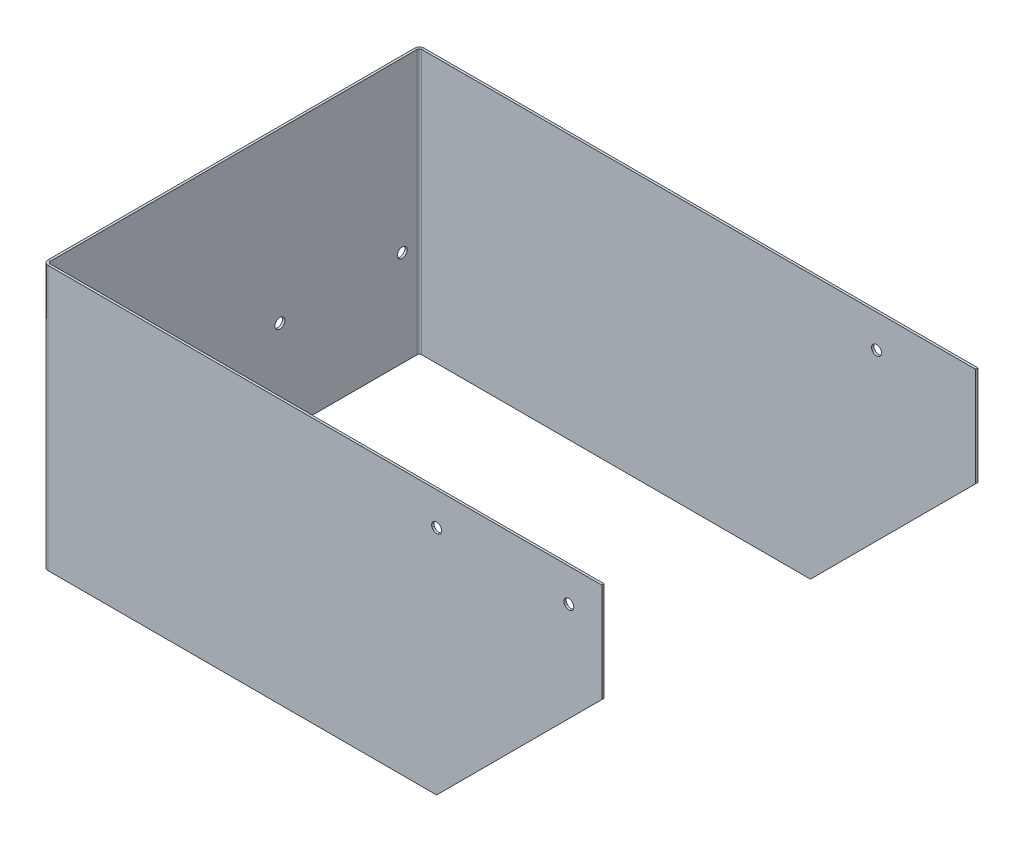
ISO-10303-21;
HEADER;
FILE_DESCRIPTION(('STEP AP214'),'2;1');
FILE_NAME('part.step','',(''),(''),'','','');
FILE_SCHEMA(('AUTOMOTIVE_DESIGN { 1 0 10303 214 1 1 1 1 }'));
ENDSEC;
DATA;
#1=APPLICATION_CONTEXT('core data for automotive mechanical design processes');
#2=APPLICATION_PROTOCOL_DEFINITION('international standard','automotive_design',2000,#1);
#3=PRODUCT_CONTEXT('',#1,'mechanical');
#4=PRODUCT('Part','Part','',(#3));
#5=PRODUCT_RELATED_PRODUCT_CATEGORY('part','',(#4));
#6=PRODUCT_DEFINITION_FORMATION('','',#4);
#7=PRODUCT_DEFINITION_CONTEXT('part definition',#1,'design');
#8=PRODUCT_DEFINITION('design','',#6,#7);
#9=PRODUCT_DEFINITION_SHAPE('','',#8);
#10=(LENGTH_UNIT() NAMED_UNIT(*) SI_UNIT(.MILLI.,.METRE.));
#11=(NAMED_UNIT(*) PLANE_ANGLE_UNIT() SI_UNIT($,.RADIAN.));
#12=(NAMED_UNIT(*) SI_UNIT($,.STERADIAN.) SOLID_ANGLE_UNIT());
#13=UNCERTAINTY_MEASURE_WITH_UNIT(LENGTH_MEASURE(1.E-05),#10,'distance_accuracy_value','');
#14=(GEOMETRIC_REPRESENTATION_CONTEXT(3) GLOBAL_UNCERTAINTY_ASSIGNED_CONTEXT((#13)) GLOBAL_UNIT_ASSIGNED_CONTEXT((#10,
#11,#12)) REPRESENTATION_CONTEXT('',''));
#15=CARTESIAN_POINT('',(0.,0.,0.));
#16=DIRECTION('',(0.,0.,1.));
#17=DIRECTION('',(1.,0.,0.));
#18=AXIS2_PLACEMENT_3D('',#15,#16,#17);
#19=CARTESIAN_POINT('',(1.40000000000001,80.,-56.9));
#20=DIRECTION('',(0.,1.,0.));
#21=DIRECTION('',(0.,0.,1.));
#22=AXIS2_PLACEMENT_3D('',#19,#20,#21);
#23=PLANE('',#22);
#24=DIRECTION('',(0.,0.,1.));
#25=VECTOR('',#24,1.);
#26=CARTESIAN_POINT('',(1.40000000000001,80.,-56.9));
#27=LINE('',#26,#25);
#28=CARTESIAN_POINT('',(1.40000000000001,80.,-56.9));
#29=VERTEX_POINT('',#28);
#30=CARTESIAN_POINT('',(1.40000000000001,80.,-56.2));
#31=VERTEX_POINT('',#30);
#32=EDGE_CURVE('E13',#29,#31,#27,.T.);
#33=ORIENTED_EDGE('',*,*,#32,.F.);
#34=CARTESIAN_POINT('',(1.40000000000001,80.,-55.5));
#35=DIRECTION('',(0.,-1.,0.));
#36=DIRECTION('',(0.,0.,-1.));
#37=AXIS2_PLACEMENT_3D('',#34,#35,#36);
#38=CIRCLE('',#37,1.4);
#39=CARTESIAN_POINT('',(0.,80.,-55.5));
#40=VERTEX_POINT('',#39);
#41=EDGE_CURVE('E245',#29,#40,#38,.F.);
#42=ORIENTED_EDGE('',*,*,#41,.T.);
#43=DIRECTION('',(-1.,0.,0.));
#44=VECTOR('',#43,1.);
#45=CARTESIAN_POINT('',(0.700000000000006,80.,-55.5));
#46=LINE('',#45,#44);
#47=CARTESIAN_POINT('',(0.700000000000006,80.,-55.5));
#48=VERTEX_POINT('',#47);
#49=EDGE_CURVE('E58',#48,#40,#46,.T.);
#50=ORIENTED_EDGE('',*,*,#49,.F.);
#51=CARTESIAN_POINT('',(1.40000000000001,80.,-55.5));
#52=DIRECTION('',(0.,1.,0.));
#53=DIRECTION('',(1.,0.,0.));
#54=AXIS2_PLACEMENT_3D('',#51,#52,#53);
#55=CIRCLE('',#54,0.7);
#56=EDGE_CURVE('E283',#31,#48,#55,.T.);
#57=ORIENTED_EDGE('',*,*,#56,.F.);
#58=EDGE_LOOP('',(#33,#42,#50,#57));
#59=FACE_BOUND('',#58,.T.);
#60=ADVANCED_FACE('F51',(#59),#23,.T.);
#61=CARTESIAN_POINT('',(0.700000000000006,80.,-55.5));
#62=DIRECTION('',(0.,1.,0.));
#63=DIRECTION('',(0.,0.,1.));
#64=AXIS2_PLACEMENT_3D('',#61,#62,#63);
#65=PLANE('',#64);
#66=DIRECTION('',(-1.,0.,0.));
#67=VECTOR('',#66,1.);
#68=CARTESIAN_POINT('',(169.,80.,-56.9));
#69=LINE('',#68,#67);
#70=CARTESIAN_POINT('',(169.,80.,-56.9));
#71=VERTEX_POINT('',#70);
#72=EDGE_CURVE('E249',#71,#29,#69,.T.);
#73=ORIENTED_EDGE('',*,*,#72,.T.);
#74=ORIENTED_EDGE('',*,*,#32,.T.);
#75=DIRECTION('',(-1.,0.,0.));
#76=VECTOR('',#75,1.);
#77=CARTESIAN_POINT('',(169.,80.,-56.2));
#78=LINE('',#77,#76);
#79=CARTESIAN_POINT('',(169.,80.,-56.2));
#80=VERTEX_POINT('',#79);
#81=EDGE_CURVE('E327',#80,#31,#78,.T.);
#82=ORIENTED_EDGE('',*,*,#81,.F.);
#83=DIRECTION('',(0.,0.,1.));
#84=VECTOR('',#83,1.);
#85=CARTESIAN_POINT('',(169.,80.,-56.9));
#86=LINE('',#85,#84);
#87=EDGE_CURVE('E330',#71,#80,#86,.T.);
#88=ORIENTED_EDGE('',*,*,#87,.F.);
#89=EDGE_LOOP('',(#73,#74,#82,#88));
#90=FACE_BOUND('',#89,.T.);
#91=ADVANCED_FACE('F334',(#90),#65,.T.);
#92=CARTESIAN_POINT('',(0.,0.,-55.5));
#93=DIRECTION('',(0.,-1.,0.));
#94=DIRECTION('',(0.,0.,-1.));
#95=AXIS2_PLACEMENT_3D('',#92,#93,#94);
#96=PLANE('',#95);
#97=DIRECTION('',(1.,0.,0.));
#98=VECTOR('',#97,1.);
#99=CARTESIAN_POINT('',(0.,0.,-55.5));
#100=LINE('',#99,#98);
#101=CARTESIAN_POINT('',(0.,0.,-55.5));
#102=VERTEX_POINT('',#101);
#103=CARTESIAN_POINT('',(0.700000000000006,0.,-55.5));
#104=VERTEX_POINT('',#103);
#105=EDGE_CURVE('E230',#102,#104,#100,.T.);
#106=ORIENTED_EDGE('',*,*,#105,.F.);
#107=CARTESIAN_POINT('',(1.40000000000001,0.,-55.5));
#108=DIRECTION('',(0.,-1.,0.));
#109=DIRECTION('',(0.,0.,-1.));
#110=AXIS2_PLACEMENT_3D('',#107,#108,#109);
#111=CIRCLE('',#110,1.4);
#112=CARTESIAN_POINT('',(1.40000000000001,0.,-56.9));
#113=VERTEX_POINT('',#112);
#114=EDGE_CURVE('E171',#113,#102,#111,.F.);
#115=ORIENTED_EDGE('',*,*,#114,.F.);
#116=DIRECTION('',(0.,0.,-1.));
#117=VECTOR('',#116,1.);
#118=CARTESIAN_POINT('',(1.40000000000001,0.,-56.2));
#119=LINE('',#118,#117);
#120=CARTESIAN_POINT('',(1.40000000000001,0.,-56.2));
#121=VERTEX_POINT('',#120);
#122=EDGE_CURVE('E169',#121,#113,#119,.T.);
#123=ORIENTED_EDGE('',*,*,#122,.F.);
#124=CARTESIAN_POINT('',(1.40000000000001,0.,-55.5));
#125=DIRECTION('',(0.,1.,0.));
#126=DIRECTION('',(1.,0.,0.));
#127=AXIS2_PLACEMENT_3D('',#124,#125,#126);
#128=CIRCLE('',#127,0.7);
#129=EDGE_CURVE('E177',#121,#104,#128,.T.);
#130=ORIENTED_EDGE('',*,*,#129,.T.);
#131=EDGE_LOOP('',(#106,#115,#123,#130));
#132=FACE_BOUND('',#131,.T.);
#133=ADVANCED_FACE('F276',(#132),#96,.T.);
#134=CARTESIAN_POINT('',(1.40000000000001,0.,-56.2));
#135=DIRECTION('',(0.,-1.,0.));
#136=DIRECTION('',(0.,0.,-1.));
#137=AXIS2_PLACEMENT_3D('',#134,#135,#136);
#138=PLANE('',#137);
#139=DIRECTION('',(0.,0.,1.));
#140=VECTOR('',#139,1.);
#141=CARTESIAN_POINT('',(0.,0.,0.));
#142=LINE('',#141,#140);
#143=CARTESIAN_POINT('',(0.,0.,55.5));
#144=VERTEX_POINT('',#143);
#145=EDGE_CURVE('E175',#102,#144,#142,.T.);
#146=ORIENTED_EDGE('',*,*,#145,.F.);
#147=ORIENTED_EDGE('',*,*,#105,.T.);
#148=DIRECTION('',(0.,0.,1.));
#149=VECTOR('',#148,1.);
#150=CARTESIAN_POINT('',(0.700000000000006,0.,-56.9));
#151=LINE('',#150,#149);
#152=CARTESIAN_POINT('',(0.700000000000006,0.,55.5));
#153=VERTEX_POINT('',#152);
#154=EDGE_CURVE('E271',#104,#153,#151,.T.);
#155=ORIENTED_EDGE('',*,*,#154,.T.);
#156=DIRECTION('',(-1.,0.,0.));
#157=VECTOR('',#156,1.);
#158=CARTESIAN_POINT('',(0.700000000000006,0.,55.5));
#159=LINE('',#158,#157);
#160=EDGE_CURVE('E221',#153,#144,#159,.T.);
#161=ORIENTED_EDGE('',*,*,#160,.T.);
#162=EDGE_LOOP('',(#146,#147,#155,#161));
#163=FACE_BOUND('',#162,.T.);
#164=ADVANCED_FACE('F289',(#163),#138,.T.);
#165=CARTESIAN_POINT('',(0.,80.,55.5));
#166=DIRECTION('',(0.,1.,0.));
#167=DIRECTION('',(0.,0.,1.));
#168=AXIS2_PLACEMENT_3D('',#165,#166,#167);
#169=PLANE('',#168);
#170=DIRECTION('',(1.,0.,0.));
#171=VECTOR('',#170,1.);
#172=CARTESIAN_POINT('',(0.,80.,55.5));
#173=LINE('',#172,#171);
#174=CARTESIAN_POINT('',(0.,80.,55.5));
#175=VERTEX_POINT('',#174);
#176=CARTESIAN_POINT('',(0.700000000000006,80.,55.5));
#177=VERTEX_POINT('',#176);
#178=EDGE_CURVE('E227',#175,#177,#173,.T.);
#179=ORIENTED_EDGE('',*,*,#178,.F.);
#180=CARTESIAN_POINT('',(1.39999999999998,80.,55.5));
#181=DIRECTION('',(0.,-1.,0.));
#182=DIRECTION('',(0.,0.,-1.));
#183=AXIS2_PLACEMENT_3D('',#180,#181,#182);
#184=CIRCLE('',#183,1.4);
#185=CARTESIAN_POINT('',(1.39999999999998,80.,56.9));
#186=VERTEX_POINT('',#185);
#187=EDGE_CURVE('E191',#175,#186,#184,.F.);
#188=ORIENTED_EDGE('',*,*,#187,.T.);
#189=DIRECTION('',(0.,0.,1.));
#190=VECTOR('',#189,1.);
#191=CARTESIAN_POINT('',(1.39999999999998,80.,56.2));
#192=LINE('',#191,#190);
#193=CARTESIAN_POINT('',(1.39999999999998,80.,56.2));
#194=VERTEX_POINT('',#193);
#195=EDGE_CURVE('E225',#194,#186,#192,.T.);
#196=ORIENTED_EDGE('',*,*,#195,.F.);
#197=CARTESIAN_POINT('',(1.39999999999998,80.,55.5));
#198=DIRECTION('',(0.,1.,0.));
#199=DIRECTION('',(1.,0.,0.));
#200=AXIS2_PLACEMENT_3D('',#197,#198,#199);
#201=CIRCLE('',#200,0.7);
#202=EDGE_CURVE('E305',#177,#194,#201,.T.);
#203=ORIENTED_EDGE('',*,*,#202,.F.);
#204=EDGE_LOOP('',(#179,#188,#196,#203));
#205=FACE_BOUND('',#204,.T.);
#206=ADVANCED_FACE('F424',(#205),#169,.T.);
#207=CARTESIAN_POINT('',(1.39999999999998,80.,56.2));
#208=DIRECTION('',(0.,1.,0.));
#209=DIRECTION('',(0.,0.,1.));
#210=AXIS2_PLACEMENT_3D('',#207,#208,#209);
#211=PLANE('',#210);
#212=DIRECTION('',(0.,0.,1.));
#213=VECTOR('',#212,1.);
#214=CARTESIAN_POINT('',(0.,80.,-56.9));
#215=LINE('',#214,#213);
#216=EDGE_CURVE('E237',#40,#175,#215,.T.);
#217=ORIENTED_EDGE('',*,*,#216,.T.);
#218=ORIENTED_EDGE('',*,*,#178,.T.);
#219=DIRECTION('',(0.,0.,1.));
#220=VECTOR('',#219,1.);
#221=CARTESIAN_POINT('',(0.700000000000006,80.,0.));
#222=LINE('',#221,#220);
#223=EDGE_CURVE('E240',#48,#177,#222,.T.);
#224=ORIENTED_EDGE('',*,*,#223,.F.);
#225=ORIENTED_EDGE('',*,*,#49,.T.);
#226=EDGE_LOOP('',(#217,#218,#224,#225));
#227=FACE_BOUND('',#226,.T.);
#228=ADVANCED_FACE('F235',(#227),#211,.T.);
#229=CARTESIAN_POINT('',(1.39999999999998,0.,56.9));
#230=DIRECTION('',(0.,-1.,0.));
#231=DIRECTION('',(0.,0.,-1.));
#232=AXIS2_PLACEMENT_3D('',#229,#230,#231);
#233=PLANE('',#232);
#234=DIRECTION('',(0.,0.,-1.));
#235=VECTOR('',#234,1.);
#236=CARTESIAN_POINT('',(1.39999999999998,0.,56.9));
#237=LINE('',#236,#235);
#238=CARTESIAN_POINT('',(1.39999999999998,0.,56.9));
#239=VERTEX_POINT('',#238);
#240=CARTESIAN_POINT('',(1.39999999999998,0.,56.2));
#241=VERTEX_POINT('',#240);
#242=EDGE_CURVE('E223',#239,#241,#237,.T.);
#243=ORIENTED_EDGE('',*,*,#242,.F.);
#244=CARTESIAN_POINT('',(1.39999999999998,0.,55.5));
#245=DIRECTION('',(0.,-1.,0.));
#246=DIRECTION('',(0.,0.,-1.));
#247=AXIS2_PLACEMENT_3D('',#244,#245,#246);
#248=CIRCLE('',#247,1.4);
#249=EDGE_CURVE('E183',#144,#239,#248,.F.);
#250=ORIENTED_EDGE('',*,*,#249,.F.);
#251=ORIENTED_EDGE('',*,*,#160,.F.);
#252=CARTESIAN_POINT('',(1.39999999999998,0.,55.5));
#253=DIRECTION('',(0.,1.,0.));
#254=DIRECTION('',(1.,0.,0.));
#255=AXIS2_PLACEMENT_3D('',#252,#253,#254);
#256=CIRCLE('',#255,0.7);
#257=EDGE_CURVE('E268',#153,#241,#256,.T.);
#258=ORIENTED_EDGE('',*,*,#257,.T.);
#259=EDGE_LOOP('',(#243,#250,#251,#258));
#260=FACE_BOUND('',#259,.T.);
#261=ADVANCED_FACE('F295',(#260),#233,.T.);
#262=CARTESIAN_POINT('',(0.700000000000006,0.,55.5));
#263=DIRECTION('',(0.,-1.,0.));
#264=DIRECTION('',(0.,0.,-1.));
#265=AXIS2_PLACEMENT_3D('',#262,#263,#264);
#266=PLANE('',#265);
#267=DIRECTION('',(0.,0.,1.));
#268=VECTOR('',#267,1.);
#269=CARTESIAN_POINT('',(119.,0.,-56.9));
#270=LINE('',#269,#268);
#271=CARTESIAN_POINT('',(119.,0.,56.2));
#272=VERTEX_POINT('',#271);
#273=CARTESIAN_POINT('',(119.,0.,56.9));
#274=VERTEX_POINT('',#273);
#275=EDGE_CURVE('E65',#272,#274,#270,.T.);
#276=ORIENTED_EDGE('',*,*,#275,.T.);
#277=DIRECTION('',(1.,0.,0.));
#278=VECTOR('',#277,1.);
#279=CARTESIAN_POINT('',(0.,0.,56.9));
#280=LINE('',#279,#278);
#281=EDGE_CURVE('E261',#239,#274,#280,.T.);
#282=ORIENTED_EDGE('',*,*,#281,.F.);
#283=ORIENTED_EDGE('',*,*,#242,.T.);
#284=DIRECTION('',(1.,0.,0.));
#285=VECTOR('',#284,1.);
#286=CARTESIAN_POINT('',(0.,0.,56.2));
#287=LINE('',#286,#285);
#288=EDGE_CURVE('E264',#241,#272,#287,.T.);
#289=ORIENTED_EDGE('',*,*,#288,.T.);
#290=EDGE_LOOP('',(#276,#282,#283,#289));
#291=FACE_BOUND('',#290,.T.);
#292=ADVANCED_FACE('F298',(#291),#266,.T.);
#293=CARTESIAN_POINT('',(0.,80.,56.9));
#294=DIRECTION('',(0.,0.,-1.));
#295=DIRECTION('',(-1.,0.,0.));
#296=AXIS2_PLACEMENT_3D('',#293,#294,#295);
#297=PLANE('',#296);
#298=CARTESIAN_POINT('',(159.,70.,56.9));
#299=DIRECTION('',(0.,0.,1.));
#300=DIRECTION('',(1.,0.,0.));
#301=AXIS2_PLACEMENT_3D('',#298,#299,#300);
#302=CIRCLE('',#301,1.5);
#303=CARTESIAN_POINT('',(160.5,70.,56.9));
#304=VERTEX_POINT('',#303);
#305=EDGE_CURVE('E343',#304,#304,#302,.T.);
#306=ORIENTED_EDGE('',*,*,#305,.F.);
#307=EDGE_LOOP('',(#306));
#308=FACE_BOUND('',#307,.T.);
#309=CARTESIAN_POINT('',(119.,70.,56.9));
#310=DIRECTION('',(0.,0.,1.));
#311=DIRECTION('',(1.,0.,0.));
#312=AXIS2_PLACEMENT_3D('',#309,#310,#311);
#313=CIRCLE('',#312,1.5);
#314=CARTESIAN_POINT('',(120.5,70.,56.9));
#315=VERTEX_POINT('',#314);
#316=EDGE_CURVE('E344',#315,#315,#313,.T.);
#317=ORIENTED_EDGE('',*,*,#316,.F.);
#318=EDGE_LOOP('',(#317));
#319=FACE_BOUND('',#318,.T.);
#320=ORIENTED_EDGE('',*,*,#281,.T.);
#321=DIRECTION('',(0.707106781186548,0.707106781186548,0.));
#322=VECTOR('',#321,1.);
#323=CARTESIAN_POINT('',(99.5,-19.5,56.9));
#324=LINE('',#323,#322);
#325=CARTESIAN_POINT('',(169.,50.,56.9));
#326=VERTEX_POINT('',#325);
#327=EDGE_CURVE('E265',#274,#326,#324,.T.);
#328=ORIENTED_EDGE('',*,*,#327,.T.);
#329=DIRECTION('',(0.,-1.,0.));
#330=VECTOR('',#329,1.);
#331=CARTESIAN_POINT('',(169.,80.,56.9));
#332=LINE('',#331,#330);
#333=CARTESIAN_POINT('',(169.,80.,56.9));
#334=VERTEX_POINT('',#333);
#335=EDGE_CURVE('E218',#334,#326,#332,.T.);
#336=ORIENTED_EDGE('',*,*,#335,.F.);
#337=DIRECTION('',(1.,0.,0.));
#338=VECTOR('',#337,1.);
#339=CARTESIAN_POINT('',(0.,80.,56.9));
#340=LINE('',#339,#338);
#341=EDGE_CURVE('E186',#186,#334,#340,.T.);
#342=ORIENTED_EDGE('',*,*,#341,.F.);
#343=DIRECTION('',(0.,-1.,0.));
#344=VECTOR('',#343,1.);
#345=CARTESIAN_POINT('',(1.39999999999998,80.,56.9));
#346=LINE('',#345,#344);
#347=EDGE_CURVE('E187',#186,#239,#346,.T.);
#348=ORIENTED_EDGE('',*,*,#347,.T.);
#349=EDGE_LOOP('',(#320,#328,#336,#342,#348));
#350=FACE_BOUND('',#349,.T.);
#351=ADVANCED_FACE('F434',(#308,#319,#350),#297,.F.);
#352=CARTESIAN_POINT('',(169.,80.,56.2));
#353=DIRECTION('',(1.,0.,0.));
#354=DIRECTION('',(0.,0.,-1.));
#355=AXIS2_PLACEMENT_3D('',#352,#353,#354);
#356=PLANE('',#355);
#357=DIRECTION('',(0.,0.,1.));
#358=VECTOR('',#357,1.);
#359=CARTESIAN_POINT('',(169.,50.,-56.9));
#360=LINE('',#359,#358);
#361=CARTESIAN_POINT('',(169.,50.,56.2));
#362=VERTEX_POINT('',#361);
#363=EDGE_CURVE('E155',#362,#326,#360,.T.);
#364=ORIENTED_EDGE('',*,*,#363,.F.);
#365=DIRECTION('',(0.,-1.,0.));
#366=VECTOR('',#365,1.);
#367=CARTESIAN_POINT('',(169.,80.,56.2));
#368=LINE('',#367,#366);
#369=CARTESIAN_POINT('',(169.,80.,56.2));
#370=VERTEX_POINT('',#369);
#371=EDGE_CURVE('E215',#370,#362,#368,.T.);
#372=ORIENTED_EDGE('',*,*,#371,.F.);
#373=DIRECTION('',(0.,0.,1.));
#374=VECTOR('',#373,1.);
#375=CARTESIAN_POINT('',(169.,80.,56.2));
#376=LINE('',#375,#374);
#377=EDGE_CURVE('E319',#370,#334,#376,.T.);
#378=ORIENTED_EDGE('',*,*,#377,.T.);
#379=ORIENTED_EDGE('',*,*,#335,.T.);
#380=EDGE_LOOP('',(#364,#372,#378,#379));
#381=FACE_BOUND('',#380,.T.);
#382=ADVANCED_FACE('F437',(#381),#356,.T.);
#383=CARTESIAN_POINT('',(0.,80.,56.2));
#384=DIRECTION('',(0.,0.,-1.));
#385=DIRECTION('',(-1.,0.,0.));
#386=AXIS2_PLACEMENT_3D('',#383,#384,#385);
#387=PLANE('',#386);
#388=CARTESIAN_POINT('',(159.,70.,56.2));
#389=DIRECTION('',(0.,0.,-1.));
#390=DIRECTION('',(-1.,0.,0.));
#391=AXIS2_PLACEMENT_3D('',#388,#389,#390);
#392=CIRCLE('',#391,1.5);
#393=CARTESIAN_POINT('',(157.5,70.,56.2));
#394=VERTEX_POINT('',#393);
#395=EDGE_CURVE('E165',#394,#394,#392,.F.);
#396=ORIENTED_EDGE('',*,*,#395,.T.);
#397=EDGE_LOOP('',(#396));
#398=FACE_BOUND('',#397,.T.);
#399=CARTESIAN_POINT('',(119.,70.,56.2));
#400=DIRECTION('',(0.,0.,-1.));
#401=DIRECTION('',(-1.,0.,0.));
#402=AXIS2_PLACEMENT_3D('',#399,#400,#401);
#403=CIRCLE('',#402,1.5);
#404=CARTESIAN_POINT('',(117.5,70.,56.2));
#405=VERTEX_POINT('',#404);
#406=EDGE_CURVE('E340',#405,#405,#403,.F.);
#407=ORIENTED_EDGE('',*,*,#406,.T.);
#408=EDGE_LOOP('',(#407));
#409=FACE_BOUND('',#408,.T.);
#410=DIRECTION('',(0.707106781186548,0.707106781186548,0.));
#411=VECTOR('',#410,1.);
#412=CARTESIAN_POINT('',(99.5,-19.5,56.2));
#413=LINE('',#412,#411);
#414=EDGE_CURVE('E310',#272,#362,#413,.T.);
#415=ORIENTED_EDGE('',*,*,#414,.F.);
#416=ORIENTED_EDGE('',*,*,#288,.F.);
#417=DIRECTION('',(0.,-1.,0.));
#418=VECTOR('',#417,1.);
#419=CARTESIAN_POINT('',(1.39999999999998,80.,56.2));
#420=LINE('',#419,#418);
#421=EDGE_CURVE('E212',#194,#241,#420,.T.);
#422=ORIENTED_EDGE('',*,*,#421,.F.);
#423=DIRECTION('',(1.,0.,0.));
#424=VECTOR('',#423,1.);
#425=CARTESIAN_POINT('',(0.,80.,56.2));
#426=LINE('',#425,#424);
#427=EDGE_CURVE('E322',#194,#370,#426,.T.);
#428=ORIENTED_EDGE('',*,*,#427,.T.);
#429=ORIENTED_EDGE('',*,*,#371,.T.);
#430=EDGE_LOOP('',(#415,#416,#422,#428,#429));
#431=FACE_BOUND('',#430,.T.);
#432=ADVANCED_FACE('F309',(#398,#409,#431),#387,.T.);
#433=CARTESIAN_POINT('',(1.39999999999998,80.,55.5));
#434=DIRECTION('',(0.,-1.,0.));
#435=DIRECTION('',(0.,0.,-1.));
#436=AXIS2_PLACEMENT_3D('',#433,#434,#435);
#437=CYLINDRICAL_SURFACE('',#436,0.7);
#438=ORIENTED_EDGE('',*,*,#257,.F.);
#439=DIRECTION('',(0.,-1.,0.));
#440=VECTOR('',#439,1.);
#441=CARTESIAN_POINT('',(0.700000000000006,80.,55.5));
#442=LINE('',#441,#440);
#443=EDGE_CURVE('E209',#177,#153,#442,.T.);
#444=ORIENTED_EDGE('',*,*,#443,.F.);
#445=ORIENTED_EDGE('',*,*,#202,.T.);
#446=ORIENTED_EDGE('',*,*,#421,.T.);
#447=EDGE_LOOP('',(#438,#444,#445,#446));
#448=FACE_BOUND('',#447,.T.);
#449=ADVANCED_FACE('F303',(#448),#437,.F.);
#450=CARTESIAN_POINT('',(0.700000000000006,80.,-56.9));
#451=DIRECTION('',(1.,0.,0.));
#452=DIRECTION('',(0.,0.,-1.));
#453=AXIS2_PLACEMENT_3D('',#450,#451,#452);
#454=PLANE('',#453);
#455=CARTESIAN_POINT('',(0.700000000000006,29.,-51.));
#456=DIRECTION('',(1.,0.,0.));
#457=DIRECTION('',(0.,0.,-1.));
#458=AXIS2_PLACEMENT_3D('',#455,#456,#457);
#459=CIRCLE('',#458,1.5);
#460=CARTESIAN_POINT('',(0.700000000000006,29.,-52.5));
#461=VERTEX_POINT('',#460);
#462=EDGE_CURVE('E357',#461,#461,#459,.F.);
#463=ORIENTED_EDGE('',*,*,#462,.T.);
#464=EDGE_LOOP('',(#463));
#465=FACE_BOUND('',#464,.T.);
#466=CARTESIAN_POINT('',(0.700000000000006,29.,-14.));
#467=DIRECTION('',(1.,0.,0.));
#468=DIRECTION('',(0.,0.,-1.));
#469=AXIS2_PLACEMENT_3D('',#466,#467,#468);
#470=CIRCLE('',#469,1.5);
#471=CARTESIAN_POINT('',(0.700000000000006,29.,-15.5));
#472=VERTEX_POINT('',#471);
#473=EDGE_CURVE('E371',#472,#472,#470,.F.);
#474=ORIENTED_EDGE('',*,*,#473,.T.);
#475=EDGE_LOOP('',(#474));
#476=FACE_BOUND('',#475,.T.);
#477=CARTESIAN_POINT('',(0.700000000000006,29.,14.));
#478=DIRECTION('',(1.,0.,0.));
#479=DIRECTION('',(0.,0.,-1.));
#480=AXIS2_PLACEMENT_3D('',#477,#478,#479);
#481=CIRCLE('',#480,1.5);
#482=CARTESIAN_POINT('',(0.700000000000006,29.,12.5));
#483=VERTEX_POINT('',#482);
#484=EDGE_CURVE('E365',#483,#483,#481,.F.);
#485=ORIENTED_EDGE('',*,*,#484,.T.);
#486=EDGE_LOOP('',(#485));
#487=FACE_BOUND('',#486,.T.);
#488=CARTESIAN_POINT('',(0.700000000000006,29.,51.));
#489=DIRECTION('',(1.,0.,0.));
#490=DIRECTION('',(0.,0.,-1.));
#491=AXIS2_PLACEMENT_3D('',#488,#489,#490);
#492=CIRCLE('',#491,1.5);
#493=CARTESIAN_POINT('',(0.700000000000006,29.,49.5));
#494=VERTEX_POINT('',#493);
#495=EDGE_CURVE('E358',#494,#494,#492,.F.);
#496=ORIENTED_EDGE('',*,*,#495,.T.);
#497=EDGE_LOOP('',(#496));
#498=FACE_BOUND('',#497,.T.);
#499=ORIENTED_EDGE('',*,*,#154,.F.);
#500=DIRECTION('',(0.,-1.,0.));
#501=VECTOR('',#500,1.);
#502=CARTESIAN_POINT('',(0.700000000000006,80.,-55.5));
#503=LINE('',#502,#501);
#504=EDGE_CURVE('E206',#48,#104,#503,.T.);
#505=ORIENTED_EDGE('',*,*,#504,.F.);
#506=ORIENTED_EDGE('',*,*,#223,.T.);
#507=ORIENTED_EDGE('',*,*,#443,.T.);
#508=EDGE_LOOP('',(#499,#505,#506,#507));
#509=FACE_BOUND('',#508,.T.);
#510=ADVANCED_FACE('F285',(#465,#476,#487,#498,#509),#454,.T.);
#511=CARTESIAN_POINT('',(1.40000000000001,80.,-55.5));
#512=DIRECTION('',(0.,-1.,0.));
#513=DIRECTION('',(0.,0.,-1.));
#514=AXIS2_PLACEMENT_3D('',#511,#512,#513);
#515=CYLINDRICAL_SURFACE('',#514,0.7);
#516=ORIENTED_EDGE('',*,*,#129,.F.);
#517=DIRECTION('',(0.,-1.,0.));
#518=VECTOR('',#517,1.);
#519=CARTESIAN_POINT('',(1.40000000000001,80.,-56.2));
#520=LINE('',#519,#518);
#521=EDGE_CURVE('E203',#31,#121,#520,.T.);
#522=ORIENTED_EDGE('',*,*,#521,.F.);
#523=ORIENTED_EDGE('',*,*,#56,.T.);
#524=ORIENTED_EDGE('',*,*,#504,.T.);
#525=EDGE_LOOP('',(#516,#522,#523,#524));
#526=FACE_BOUND('',#525,.T.);
#527=ADVANCED_FACE('F280',(#526),#515,.F.);
#528=CARTESIAN_POINT('',(169.,80.,-56.2));
#529=DIRECTION('',(0.,0.,1.));
#530=DIRECTION('',(1.,0.,0.));
#531=AXIS2_PLACEMENT_3D('',#528,#529,#530);
#532=PLANE('',#531);
#533=CARTESIAN_POINT('',(139.,70.,-56.2));
#534=DIRECTION('',(0.,0.,1.));
#535=DIRECTION('',(1.,0.,0.));
#536=AXIS2_PLACEMENT_3D('',#533,#534,#535);
#537=CIRCLE('',#536,1.5);
#538=CARTESIAN_POINT('',(140.5,70.,-56.2));
#539=VERTEX_POINT('',#538);
#540=EDGE_CURVE('E347',#539,#539,#537,.T.);
#541=ORIENTED_EDGE('',*,*,#540,.F.);
#542=EDGE_LOOP('',(#541));
#543=FACE_BOUND('',#542,.T.);
#544=DIRECTION('',(-0.707106781186548,-0.707106781186548,0.));
#545=VECTOR('',#544,1.);
#546=CARTESIAN_POINT('',(184.,65.,-56.2));
#547=LINE('',#546,#545);
#548=CARTESIAN_POINT('',(169.,50.,-56.2));
#549=VERTEX_POINT('',#548);
#550=CARTESIAN_POINT('',(119.,0.,-56.2));
#551=VERTEX_POINT('',#550);
#552=EDGE_CURVE('E73',#549,#551,#547,.T.);
#553=ORIENTED_EDGE('',*,*,#552,.F.);
#554=DIRECTION('',(0.,-1.,0.));
#555=VECTOR('',#554,1.);
#556=CARTESIAN_POINT('',(169.,80.,-56.2));
#557=LINE('',#556,#555);
#558=EDGE_CURVE('E200',#80,#549,#557,.T.);
#559=ORIENTED_EDGE('',*,*,#558,.F.);
#560=ORIENTED_EDGE('',*,*,#81,.T.);
#561=ORIENTED_EDGE('',*,*,#521,.T.);
#562=DIRECTION('',(-1.,0.,0.));
#563=VECTOR('',#562,1.);
#564=CARTESIAN_POINT('',(169.,0.,-56.2));
#565=LINE('',#564,#563);
#566=EDGE_CURVE('E172',#551,#121,#565,.T.);
#567=ORIENTED_EDGE('',*,*,#566,.F.);
#568=EDGE_LOOP('',(#553,#559,#560,#561,#567));
#569=FACE_BOUND('',#568,.T.);
#570=ADVANCED_FACE('F409',(#543,#569),#532,.T.);
#571=CARTESIAN_POINT('',(169.,80.,-56.9));
#572=DIRECTION('',(1.,0.,0.));
#573=DIRECTION('',(0.,0.,-1.));
#574=AXIS2_PLACEMENT_3D('',#571,#572,#573);
#575=PLANE('',#574);
#576=CARTESIAN_POINT('',(169.,50.,-56.9));
#577=VERTEX_POINT('',#576);
#578=EDGE_CURVE('E315',#577,#549,#360,.T.);
#579=ORIENTED_EDGE('',*,*,#578,.F.);
#580=DIRECTION('',(0.,-1.,0.));
#581=VECTOR('',#580,1.);
#582=CARTESIAN_POINT('',(169.,80.,-56.9));
#583=LINE('',#582,#581);
#584=EDGE_CURVE('E164',#71,#577,#583,.T.);
#585=ORIENTED_EDGE('',*,*,#584,.F.);
#586=ORIENTED_EDGE('',*,*,#87,.T.);
#587=ORIENTED_EDGE('',*,*,#558,.T.);
#588=EDGE_LOOP('',(#579,#585,#586,#587));
#589=FACE_BOUND('',#588,.T.);
#590=ADVANCED_FACE('F337',(#589),#575,.T.);
#591=CARTESIAN_POINT('',(169.,80.,-56.9));
#592=DIRECTION('',(0.,0.,1.));
#593=DIRECTION('',(1.,0.,0.));
#594=AXIS2_PLACEMENT_3D('',#591,#592,#593);
#595=PLANE('',#594);
#596=CARTESIAN_POINT('',(139.,70.,-56.9));
#597=DIRECTION('',(0.,0.,1.));
#598=DIRECTION('',(1.,0.,0.));
#599=AXIS2_PLACEMENT_3D('',#596,#597,#598);
#600=CIRCLE('',#599,1.5);
#601=CARTESIAN_POINT('',(140.5,70.,-56.9));
#602=VERTEX_POINT('',#601);
#603=EDGE_CURVE('E354',#602,#602,#600,.T.);
#604=ORIENTED_EDGE('',*,*,#603,.T.);
#605=EDGE_LOOP('',(#604));
#606=FACE_BOUND('',#605,.T.);
#607=ORIENTED_EDGE('',*,*,#584,.T.);
#608=DIRECTION('',(-0.707106781186547,-0.707106781186547,0.));
#609=VECTOR('',#608,1.);
#610=CARTESIAN_POINT('',(119.,0.,-56.9));
#611=LINE('',#610,#609);
#612=CARTESIAN_POINT('',(119.,0.,-56.9));
#613=VERTEX_POINT('',#612);
#614=EDGE_CURVE('E150',#577,#613,#611,.T.);
#615=ORIENTED_EDGE('',*,*,#614,.T.);
#616=DIRECTION('',(-1.,0.,0.));
#617=VECTOR('',#616,1.);
#618=CARTESIAN_POINT('',(169.,0.,-56.9));
#619=LINE('',#618,#617);
#620=EDGE_CURVE('E161',#613,#113,#619,.T.);
#621=ORIENTED_EDGE('',*,*,#620,.T.);
#622=DIRECTION('',(0.,-1.,0.));
#623=VECTOR('',#622,1.);
#624=CARTESIAN_POINT('',(1.40000000000001,80.,-56.9));
#625=LINE('',#624,#623);
#626=EDGE_CURVE('E197',#29,#113,#625,.T.);
#627=ORIENTED_EDGE('',*,*,#626,.F.);
#628=ORIENTED_EDGE('',*,*,#72,.F.);
#629=EDGE_LOOP('',(#607,#615,#621,#627,#628));
#630=FACE_BOUND('',#629,.T.);
#631=ADVANCED_FACE('F159',(#606,#630),#595,.F.);
#632=CARTESIAN_POINT('',(1.40000000000001,80.,-55.5));
#633=DIRECTION('',(0.,-1.,0.));
#634=DIRECTION('',(0.,0.,-1.));
#635=AXIS2_PLACEMENT_3D('',#632,#633,#634);
#636=CYLINDRICAL_SURFACE('',#635,1.4);
#637=ORIENTED_EDGE('',*,*,#114,.T.);
#638=DIRECTION('',(0.,-1.,0.));
#639=VECTOR('',#638,1.);
#640=CARTESIAN_POINT('',(0.,80.,-55.5));
#641=LINE('',#640,#639);
#642=EDGE_CURVE('E194',#40,#102,#641,.T.);
#643=ORIENTED_EDGE('',*,*,#642,.F.);
#644=ORIENTED_EDGE('',*,*,#41,.F.);
#645=ORIENTED_EDGE('',*,*,#626,.T.);
#646=EDGE_LOOP('',(#637,#643,#644,#645));
#647=FACE_BOUND('',#646,.T.);
#648=ADVANCED_FACE('F251',(#647),#636,.T.);
#649=CARTESIAN_POINT('',(0.,80.,0.));
#650=DIRECTION('',(1.,0.,0.));
#651=DIRECTION('',(0.,0.,-1.));
#652=AXIS2_PLACEMENT_3D('',#649,#650,#651);
#653=PLANE('',#652);
#654=CARTESIAN_POINT('',(0.,29.,-51.));
#655=DIRECTION('',(-1.,0.,0.));
#656=DIRECTION('',(0.,0.,1.));
#657=AXIS2_PLACEMENT_3D('',#654,#655,#656);
#658=CIRCLE('',#657,1.5);
#659=CARTESIAN_POINT('',(0.,29.,-49.5));
#660=VERTEX_POINT('',#659);
#661=EDGE_CURVE('E374',#660,#660,#658,.T.);
#662=ORIENTED_EDGE('',*,*,#661,.F.);
#663=EDGE_LOOP('',(#662));
#664=FACE_BOUND('',#663,.T.);
#665=CARTESIAN_POINT('',(0.,29.,-14.));
#666=DIRECTION('',(-1.,0.,0.));
#667=DIRECTION('',(0.,0.,1.));
#668=AXIS2_PLACEMENT_3D('',#665,#666,#667);
#669=CIRCLE('',#668,1.5);
#670=CARTESIAN_POINT('',(0.,29.,-12.5));
#671=VERTEX_POINT('',#670);
#672=EDGE_CURVE('E368',#671,#671,#669,.T.);
#673=ORIENTED_EDGE('',*,*,#672,.F.);
#674=EDGE_LOOP('',(#673));
#675=FACE_BOUND('',#674,.T.);
#676=CARTESIAN_POINT('',(0.,29.,14.));
#677=DIRECTION('',(-1.,0.,0.));
#678=DIRECTION('',(0.,0.,-1.));
#679=AXIS2_PLACEMENT_3D('',#676,#677,#678);
#680=CIRCLE('',#679,1.5);
#681=CARTESIAN_POINT('',(0.,29.,12.5));
#682=VERTEX_POINT('',#681);
#683=EDGE_CURVE('E361',#682,#682,#680,.T.);
#684=ORIENTED_EDGE('',*,*,#683,.F.);
#685=EDGE_LOOP('',(#684));
#686=FACE_BOUND('',#685,.T.);
#687=CARTESIAN_POINT('',(0.,29.,51.));
#688=DIRECTION('',(-1.,0.,0.));
#689=DIRECTION('',(0.,0.,-1.));
#690=AXIS2_PLACEMENT_3D('',#687,#688,#689);
#691=CIRCLE('',#690,1.5);
#692=CARTESIAN_POINT('',(0.,29.,49.5));
#693=VERTEX_POINT('',#692);
#694=EDGE_CURVE('E362',#693,#693,#691,.T.);
#695=ORIENTED_EDGE('',*,*,#694,.F.);
#696=EDGE_LOOP('',(#695));
#697=FACE_BOUND('',#696,.T.);
#698=ORIENTED_EDGE('',*,*,#145,.T.);
#699=DIRECTION('',(0.,-1.,0.));
#700=VECTOR('',#699,1.);
#701=CARTESIAN_POINT('',(0.,80.,55.5));
#702=LINE('',#701,#700);
#703=EDGE_CURVE('E190',#175,#144,#702,.T.);
#704=ORIENTED_EDGE('',*,*,#703,.F.);
#705=ORIENTED_EDGE('',*,*,#216,.F.);
#706=ORIENTED_EDGE('',*,*,#642,.T.);
#707=EDGE_LOOP('',(#698,#704,#705,#706));
#708=FACE_BOUND('',#707,.T.);
#709=ADVANCED_FACE('F254',(#664,#675,#686,#697,#708),#653,.F.);
#710=CARTESIAN_POINT('',(1.39999999999998,80.,55.5));
#711=DIRECTION('',(0.,-1.,0.));
#712=DIRECTION('',(0.,0.,-1.));
#713=AXIS2_PLACEMENT_3D('',#710,#711,#712);
#714=CYLINDRICAL_SURFACE('',#713,1.4);
#715=ORIENTED_EDGE('',*,*,#249,.T.);
#716=ORIENTED_EDGE('',*,*,#347,.F.);
#717=ORIENTED_EDGE('',*,*,#187,.F.);
#718=ORIENTED_EDGE('',*,*,#703,.T.);
#719=EDGE_LOOP('',(#715,#716,#717,#718));
#720=FACE_BOUND('',#719,.T.);
#721=ADVANCED_FACE('F292',(#720),#714,.T.);
#722=CARTESIAN_POINT('',(1.39999999999998,80.,55.5));
#723=DIRECTION('',(0.,1.,0.));
#724=DIRECTION('',(1.,0.,0.));
#725=AXIS2_PLACEMENT_3D('',#722,#723,#724);
#726=PLANE('',#725);
#727=ORIENTED_EDGE('',*,*,#341,.T.);
#728=ORIENTED_EDGE('',*,*,#377,.F.);
#729=ORIENTED_EDGE('',*,*,#427,.F.);
#730=ORIENTED_EDGE('',*,*,#195,.T.);
#731=EDGE_LOOP('',(#727,#728,#729,#730));
#732=FACE_BOUND('',#731,.T.);
#733=ADVANCED_FACE('F466',(#732),#726,.T.);
#734=CARTESIAN_POINT('',(1.39999999999998,0.,55.5));
#735=DIRECTION('',(0.,1.,0.));
#736=DIRECTION('',(1.,0.,0.));
#737=AXIS2_PLACEMENT_3D('',#734,#735,#736);
#738=PLANE('',#737);
#739=ORIENTED_EDGE('',*,*,#620,.F.);
#740=EDGE_CURVE('E147',#613,#551,#270,.T.);
#741=ORIENTED_EDGE('',*,*,#740,.T.);
#742=ORIENTED_EDGE('',*,*,#566,.T.);
#743=ORIENTED_EDGE('',*,*,#122,.T.);
#744=EDGE_LOOP('',(#739,#741,#742,#743));
#745=FACE_BOUND('',#744,.T.);
#746=ADVANCED_FACE('F167',(#745),#738,.F.);
#747=CARTESIAN_POINT('',(119.,0.,-56.9));
#748=DIRECTION('',(-0.707106781186547,0.707106781186547,0.));
#749=DIRECTION('',(-0.707106781186548,-0.707106781186548,0.));
#750=AXIS2_PLACEMENT_3D('',#747,#748,#749);
#751=PLANE('',#750);
#752=ORIENTED_EDGE('',*,*,#552,.T.);
#753=ORIENTED_EDGE('',*,*,#740,.F.);
#754=ORIENTED_EDGE('',*,*,#614,.F.);
#755=ORIENTED_EDGE('',*,*,#578,.T.);
#756=EDGE_LOOP('',(#752,#753,#754,#755));
#757=FACE_BOUND('',#756,.T.);
#758=ADVANCED_FACE('F149',(#757),#751,.F.);
#759=ORIENTED_EDGE('',*,*,#275,.F.);
#760=ORIENTED_EDGE('',*,*,#414,.T.);
#761=ORIENTED_EDGE('',*,*,#363,.T.);
#762=ORIENTED_EDGE('',*,*,#327,.F.);
#763=EDGE_LOOP('',(#759,#760,#761,#762));
#764=FACE_BOUND('',#763,.T.);
#765=ADVANCED_FACE('F453',(#764),#751,.F.);
#766=CARTESIAN_POINT('',(119.,70.,51.9573593128807));
#767=DIRECTION('',(0.,0.,1.));
#768=DIRECTION('',(1.,0.,0.));
#769=AXIS2_PLACEMENT_3D('',#766,#767,#768);
#770=CYLINDRICAL_SURFACE('',#769,1.5);
#771=ORIENTED_EDGE('',*,*,#316,.T.);
#772=EDGE_LOOP('',(#771));
#773=FACE_BOUND('',#772,.T.);
#774=ORIENTED_EDGE('',*,*,#406,.F.);
#775=EDGE_LOOP('',(#774));
#776=FACE_BOUND('',#775,.T.);
#777=ADVANCED_FACE('F450',(#773,#776),#770,.F.);
#778=CARTESIAN_POINT('',(159.,70.,51.9573593128807));
#779=DIRECTION('',(0.,0.,1.));
#780=DIRECTION('',(1.,0.,0.));
#781=AXIS2_PLACEMENT_3D('',#778,#779,#780);
#782=CYLINDRICAL_SURFACE('',#781,1.5);
#783=ORIENTED_EDGE('',*,*,#305,.T.);
#784=EDGE_LOOP('',(#783));
#785=FACE_BOUND('',#784,.T.);
#786=ORIENTED_EDGE('',*,*,#395,.F.);
#787=EDGE_LOOP('',(#786));
#788=FACE_BOUND('',#787,.T.);
#789=ADVANCED_FACE('F452',(#785,#788),#782,.F.);
#790=CARTESIAN_POINT('',(139.,70.,-51.9573593128807));
#791=DIRECTION('',(0.,0.,-1.));
#792=DIRECTION('',(-1.,0.,0.));
#793=AXIS2_PLACEMENT_3D('',#790,#791,#792);
#794=CYLINDRICAL_SURFACE('',#793,1.5);
#795=ORIENTED_EDGE('',*,*,#603,.F.);
#796=EDGE_LOOP('',(#795));
#797=FACE_BOUND('',#796,.T.);
#798=ORIENTED_EDGE('',*,*,#540,.T.);
#799=EDGE_LOOP('',(#798));
#800=FACE_BOUND('',#799,.T.);
#801=ADVANCED_FACE('F398',(#797,#800),#794,.F.);
#802=CARTESIAN_POINT('',(4.9426406871193,29.,51.));
#803=DIRECTION('',(-1.,0.,0.));
#804=DIRECTION('',(0.,0.,1.));
#805=AXIS2_PLACEMENT_3D('',#802,#803,#804);
#806=CYLINDRICAL_SURFACE('',#805,1.5);
#807=ORIENTED_EDGE('',*,*,#694,.T.);
#808=EDGE_LOOP('',(#807));
#809=FACE_BOUND('',#808,.T.);
#810=ORIENTED_EDGE('',*,*,#495,.F.);
#811=EDGE_LOOP('',(#810));
#812=FACE_BOUND('',#811,.T.);
#813=ADVANCED_FACE('F394',(#809,#812),#806,.F.);
#814=CARTESIAN_POINT('',(4.9426406871193,29.,14.));
#815=DIRECTION('',(-1.,0.,0.));
#816=DIRECTION('',(0.,0.,1.));
#817=AXIS2_PLACEMENT_3D('',#814,#815,#816);
#818=CYLINDRICAL_SURFACE('',#817,1.5);
#819=ORIENTED_EDGE('',*,*,#683,.T.);
#820=EDGE_LOOP('',(#819));
#821=FACE_BOUND('',#820,.T.);
#822=ORIENTED_EDGE('',*,*,#484,.F.);
#823=EDGE_LOOP('',(#822));
#824=FACE_BOUND('',#823,.T.);
#825=ADVANCED_FACE('F397',(#821,#824),#818,.F.);
#826=CARTESIAN_POINT('',(4.9426406871193,29.,-14.));
#827=DIRECTION('',(-1.,0.,0.));
#828=DIRECTION('',(0.,0.,1.));
#829=AXIS2_PLACEMENT_3D('',#826,#827,#828);
#830=CYLINDRICAL_SURFACE('',#829,1.5);
#831=ORIENTED_EDGE('',*,*,#672,.T.);
#832=EDGE_LOOP('',(#831));
#833=FACE_BOUND('',#832,.T.);
#834=ORIENTED_EDGE('',*,*,#473,.F.);
#835=EDGE_LOOP('',(#834));
#836=FACE_BOUND('',#835,.T.);
#837=ADVANCED_FACE('F496',(#833,#836),#830,.F.);
#838=CARTESIAN_POINT('',(4.9426406871193,29.,-51.));
#839=DIRECTION('',(-1.,0.,0.));
#840=DIRECTION('',(0.,0.,1.));
#841=AXIS2_PLACEMENT_3D('',#838,#839,#840);
#842=CYLINDRICAL_SURFACE('',#841,1.5);
#843=ORIENTED_EDGE('',*,*,#661,.T.);
#844=EDGE_LOOP('',(#843));
#845=FACE_BOUND('',#844,.T.);
#846=ORIENTED_EDGE('',*,*,#462,.F.);
#847=EDGE_LOOP('',(#846));
#848=FACE_BOUND('',#847,.T.);
#849=ADVANCED_FACE('F382',(#845,#848),#842,.F.);
#850=CLOSED_SHELL('',(#60,#91,#133,#164,#206,#228,#261,#292,#351,#382,#432,#449,#510,#527,#570,
#590,#631,#648,#709,#721,#733,#746,#758,#765,#777,#789,#801,#813,#825,#837,#849));
#851=MANIFOLD_SOLID_BREP('B2',#850);
#852=ADVANCED_BREP_SHAPE_REPRESENTATION('',(#18,#851),#14);
#853=SHAPE_DEFINITION_REPRESENTATION(#9,#852);
ENDSEC;
END-ISO-10303-21;
